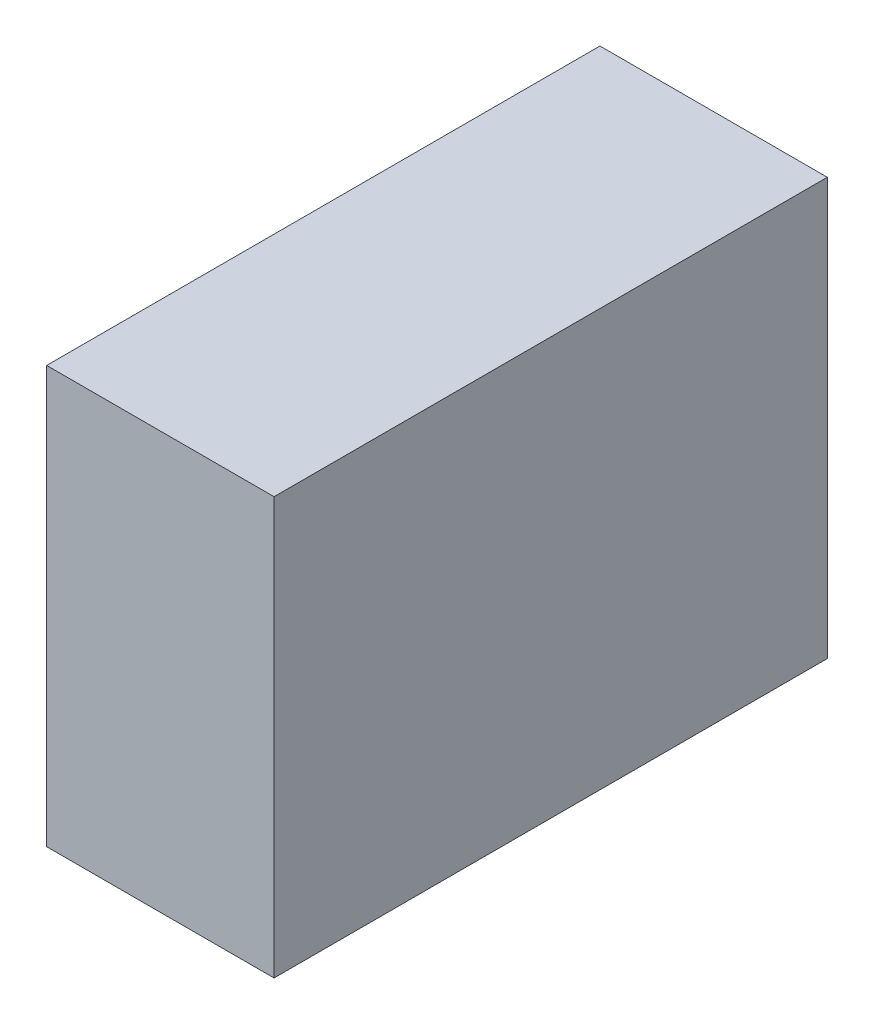
ISO-10303-21;
HEADER;
FILE_DESCRIPTION(('STEP AP214'),'2;1');
FILE_NAME('part.step','',(''),(''),'','','');
FILE_SCHEMA(('AUTOMOTIVE_DESIGN { 1 0 10303 214 1 1 1 1 }'));
ENDSEC;
DATA;
#1=APPLICATION_CONTEXT('core data for automotive mechanical design processes');
#2=APPLICATION_PROTOCOL_DEFINITION('international standard','automotive_design',2000,#1);
#3=PRODUCT_CONTEXT('',#1,'mechanical');
#4=PRODUCT('Part','Part','',(#3));
#5=PRODUCT_RELATED_PRODUCT_CATEGORY('part','',(#4));
#6=PRODUCT_DEFINITION_FORMATION('','',#4);
#7=PRODUCT_DEFINITION_CONTEXT('part definition',#1,'design');
#8=PRODUCT_DEFINITION('design','',#6,#7);
#9=PRODUCT_DEFINITION_SHAPE('','',#8);
#10=(LENGTH_UNIT() NAMED_UNIT(*) SI_UNIT(.MILLI.,.METRE.));
#11=(NAMED_UNIT(*) PLANE_ANGLE_UNIT() SI_UNIT($,.RADIAN.));
#12=(NAMED_UNIT(*) SI_UNIT($,.STERADIAN.) SOLID_ANGLE_UNIT());
#13=UNCERTAINTY_MEASURE_WITH_UNIT(LENGTH_MEASURE(1.E-05),#10,'distance_accuracy_value','');
#14=(GEOMETRIC_REPRESENTATION_CONTEXT(3) GLOBAL_UNCERTAINTY_ASSIGNED_CONTEXT((#13)) GLOBAL_UNIT_ASSIGNED_CONTEXT((#10,
#11,#12)) REPRESENTATION_CONTEXT('',''));
#15=CARTESIAN_POINT('',(0.,0.,0.));
#16=DIRECTION('',(0.,0.,1.));
#17=DIRECTION('',(1.,0.,0.));
#18=AXIS2_PLACEMENT_3D('',#15,#16,#17);
#19=CARTESIAN_POINT('',(381.,1397.,-927.1));
#20=DIRECTION('',(-1.,0.,0.));
#21=DIRECTION('',(0.,0.,1.));
#22=AXIS2_PLACEMENT_3D('',#19,#20,#21);
#23=PLANE('',#22);
#24=DIRECTION('',(0.,0.,-1.));
#25=VECTOR('',#24,1.);
#26=CARTESIAN_POINT('',(381.,0.,-927.1));
#27=LINE('',#26,#25);
#28=CARTESIAN_POINT('',(381.,0.,927.1));
#29=VERTEX_POINT('',#28);
#30=CARTESIAN_POINT('',(381.,0.,-927.1));
#31=VERTEX_POINT('',#30);
#32=EDGE_CURVE('E97',#29,#31,#27,.T.);
#33=ORIENTED_EDGE('',*,*,#32,.T.);
#34=DIRECTION('',(0.,-1.,0.));
#35=VECTOR('',#34,1.);
#36=CARTESIAN_POINT('',(381.,1397.,-927.1));
#37=LINE('',#36,#35);
#38=CARTESIAN_POINT('',(381.,1397.,-927.1));
#39=VERTEX_POINT('',#38);
#40=EDGE_CURVE('E11',#39,#31,#37,.T.);
#41=ORIENTED_EDGE('',*,*,#40,.F.);
#42=DIRECTION('',(0.,0.,-1.));
#43=VECTOR('',#42,1.);
#44=CARTESIAN_POINT('',(381.,1397.,-927.1));
#45=LINE('',#44,#43);
#46=CARTESIAN_POINT('',(381.,1397.,927.1));
#47=VERTEX_POINT('',#46);
#48=EDGE_CURVE('E85',#47,#39,#45,.T.);
#49=ORIENTED_EDGE('',*,*,#48,.F.);
#50=DIRECTION('',(0.,-1.,0.));
#51=VECTOR('',#50,1.);
#52=CARTESIAN_POINT('',(381.,1397.,927.1));
#53=LINE('',#52,#51);
#54=EDGE_CURVE('E93',#47,#29,#53,.T.);
#55=ORIENTED_EDGE('',*,*,#54,.T.);
#56=EDGE_LOOP('',(#33,#41,#49,#55));
#57=FACE_BOUND('',#56,.T.);
#58=ADVANCED_FACE('F34',(#57),#23,.F.);
#59=CARTESIAN_POINT('',(-381.,1397.,-927.1));
#60=DIRECTION('',(0.,0.,1.));
#61=DIRECTION('',(1.,0.,0.));
#62=AXIS2_PLACEMENT_3D('',#59,#60,#61);
#63=PLANE('',#62);
#64=DIRECTION('',(-1.,0.,0.));
#65=VECTOR('',#64,1.);
#66=CARTESIAN_POINT('',(-381.,0.,-927.1));
#67=LINE('',#66,#65);
#68=CARTESIAN_POINT('',(-381.,0.,-927.1));
#69=VERTEX_POINT('',#68);
#70=EDGE_CURVE('E89',#31,#69,#67,.T.);
#71=ORIENTED_EDGE('',*,*,#70,.T.);
#72=DIRECTION('',(0.,-1.,0.));
#73=VECTOR('',#72,1.);
#74=CARTESIAN_POINT('',(-381.,1397.,-927.1));
#75=LINE('',#74,#73);
#76=CARTESIAN_POINT('',(-381.,1397.,-927.1));
#77=VERTEX_POINT('',#76);
#78=EDGE_CURVE('E42',#77,#69,#75,.T.);
#79=ORIENTED_EDGE('',*,*,#78,.F.);
#80=DIRECTION('',(-1.,0.,0.));
#81=VECTOR('',#80,1.);
#82=CARTESIAN_POINT('',(-381.,1397.,-927.1));
#83=LINE('',#82,#81);
#84=EDGE_CURVE('E80',#39,#77,#83,.T.);
#85=ORIENTED_EDGE('',*,*,#84,.F.);
#86=ORIENTED_EDGE('',*,*,#40,.T.);
#87=EDGE_LOOP('',(#71,#79,#85,#86));
#88=FACE_BOUND('',#87,.T.);
#89=ADVANCED_FACE('F88',(#88),#63,.F.);
#90=CARTESIAN_POINT('',(-381.,1397.,-927.1));
#91=DIRECTION('',(1.,0.,0.));
#92=DIRECTION('',(0.,0.,-1.));
#93=AXIS2_PLACEMENT_3D('',#90,#91,#92);
#94=PLANE('',#93);
#95=DIRECTION('',(0.,0.,1.));
#96=VECTOR('',#95,1.);
#97=CARTESIAN_POINT('',(-381.,0.,-927.1));
#98=LINE('',#97,#96);
#99=CARTESIAN_POINT('',(-381.,0.,927.1));
#100=VERTEX_POINT('',#99);
#101=EDGE_CURVE('E67',#69,#100,#98,.T.);
#102=ORIENTED_EDGE('',*,*,#101,.T.);
#103=DIRECTION('',(0.,-1.,0.));
#104=VECTOR('',#103,1.);
#105=CARTESIAN_POINT('',(-381.,1397.,927.1));
#106=LINE('',#105,#104);
#107=CARTESIAN_POINT('',(-381.,1397.,927.1));
#108=VERTEX_POINT('',#107);
#109=EDGE_CURVE('E90',#108,#100,#106,.T.);
#110=ORIENTED_EDGE('',*,*,#109,.F.);
#111=DIRECTION('',(0.,0.,1.));
#112=VECTOR('',#111,1.);
#113=CARTESIAN_POINT('',(-381.,1397.,-927.1));
#114=LINE('',#113,#112);
#115=EDGE_CURVE('E83',#77,#108,#114,.T.);
#116=ORIENTED_EDGE('',*,*,#115,.F.);
#117=ORIENTED_EDGE('',*,*,#78,.T.);
#118=EDGE_LOOP('',(#102,#110,#116,#117));
#119=FACE_BOUND('',#118,.T.);
#120=ADVANCED_FACE('F91',(#119),#94,.F.);
#121=CARTESIAN_POINT('',(-381.,1397.,927.1));
#122=DIRECTION('',(0.,0.,-1.));
#123=DIRECTION('',(-1.,0.,0.));
#124=AXIS2_PLACEMENT_3D('',#121,#122,#123);
#125=PLANE('',#124);
#126=DIRECTION('',(1.,0.,0.));
#127=VECTOR('',#126,1.);
#128=CARTESIAN_POINT('',(-381.,0.,927.1));
#129=LINE('',#128,#127);
#130=EDGE_CURVE('E73',#100,#29,#129,.T.);
#131=ORIENTED_EDGE('',*,*,#130,.T.);
#132=ORIENTED_EDGE('',*,*,#54,.F.);
#133=DIRECTION('',(1.,0.,0.));
#134=VECTOR('',#133,1.);
#135=CARTESIAN_POINT('',(-381.,1397.,927.1));
#136=LINE('',#135,#134);
#137=EDGE_CURVE('E50',#108,#47,#136,.T.);
#138=ORIENTED_EDGE('',*,*,#137,.F.);
#139=ORIENTED_EDGE('',*,*,#109,.T.);
#140=EDGE_LOOP('',(#131,#132,#138,#139));
#141=FACE_BOUND('',#140,.T.);
#142=ADVANCED_FACE('F104',(#141),#125,.F.);
#143=CARTESIAN_POINT('',(0.,1397.,0.));
#144=DIRECTION('',(0.,1.,0.));
#145=DIRECTION('',(0.,0.,1.));
#146=AXIS2_PLACEMENT_3D('',#143,#144,#145);
#147=PLANE('',#146);
#148=ORIENTED_EDGE('',*,*,#48,.T.);
#149=ORIENTED_EDGE('',*,*,#84,.T.);
#150=ORIENTED_EDGE('',*,*,#115,.T.);
#151=ORIENTED_EDGE('',*,*,#137,.T.);
#152=EDGE_LOOP('',(#148,#149,#150,#151));
#153=FACE_BOUND('',#152,.T.);
#154=ADVANCED_FACE('F81',(#153),#147,.T.);
#155=CARTESIAN_POINT('',(0.,0.,0.));
#156=DIRECTION('',(0.,1.,0.));
#157=DIRECTION('',(0.,0.,1.));
#158=AXIS2_PLACEMENT_3D('',#155,#156,#157);
#159=PLANE('',#158);
#160=ORIENTED_EDGE('',*,*,#32,.F.);
#161=ORIENTED_EDGE('',*,*,#130,.F.);
#162=ORIENTED_EDGE('',*,*,#101,.F.);
#163=ORIENTED_EDGE('',*,*,#70,.F.);
#164=EDGE_LOOP('',(#160,#161,#162,#163));
#165=FACE_BOUND('',#164,.T.);
#166=ADVANCED_FACE('F107',(#165),#159,.F.);
#167=CLOSED_SHELL('',(#58,#89,#120,#142,#154,#166));
#168=MANIFOLD_SOLID_BREP('B2',#167);
#169=ADVANCED_BREP_SHAPE_REPRESENTATION('',(#18,#168),#14);
#170=SHAPE_DEFINITION_REPRESENTATION(#9,#169);
ENDSEC;
END-ISO-10303-21;
